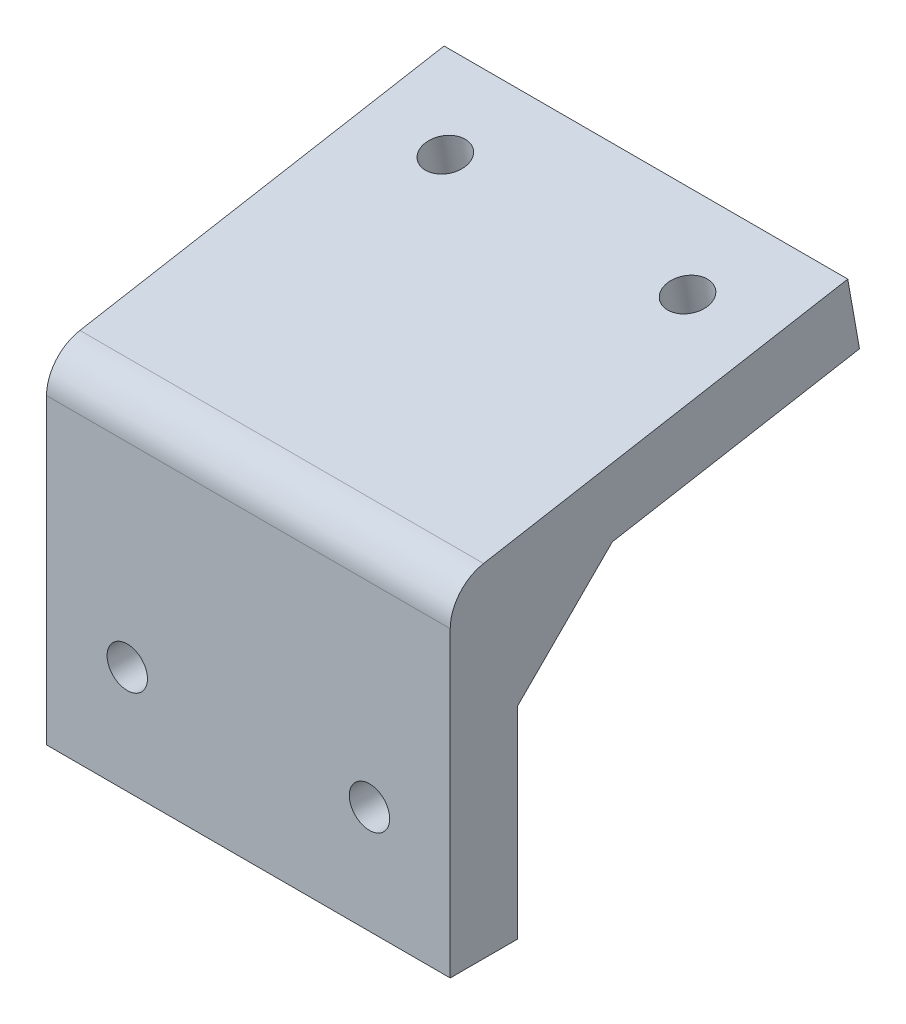
ISO-10303-21;
HEADER;
FILE_DESCRIPTION(('STEP AP214'),'2;1');
FILE_NAME('part.step','',(''),(''),'','','');
FILE_SCHEMA(('AUTOMOTIVE_DESIGN { 1 0 10303 214 1 1 1 1 }'));
ENDSEC;
DATA;
#1=APPLICATION_CONTEXT('core data for automotive mechanical design processes');
#2=APPLICATION_PROTOCOL_DEFINITION('international standard','automotive_design',2000,#1);
#3=PRODUCT_CONTEXT('',#1,'mechanical');
#4=PRODUCT('Part','Part','',(#3));
#5=PRODUCT_RELATED_PRODUCT_CATEGORY('part','',(#4));
#6=PRODUCT_DEFINITION_FORMATION('','',#4);
#7=PRODUCT_DEFINITION_CONTEXT('part definition',#1,'design');
#8=PRODUCT_DEFINITION('design','',#6,#7);
#9=PRODUCT_DEFINITION_SHAPE('','',#8);
#10=(LENGTH_UNIT() NAMED_UNIT(*) SI_UNIT(.MILLI.,.METRE.));
#11=(NAMED_UNIT(*) PLANE_ANGLE_UNIT() SI_UNIT($,.RADIAN.));
#12=(NAMED_UNIT(*) SI_UNIT($,.STERADIAN.) SOLID_ANGLE_UNIT());
#13=UNCERTAINTY_MEASURE_WITH_UNIT(LENGTH_MEASURE(1.E-05),#10,'distance_accuracy_value','');
#14=(GEOMETRIC_REPRESENTATION_CONTEXT(3) GLOBAL_UNCERTAINTY_ASSIGNED_CONTEXT((#13)) GLOBAL_UNIT_ASSIGNED_CONTEXT((#10,
#11,#12)) REPRESENTATION_CONTEXT('',''));
#15=CARTESIAN_POINT('',(0.,0.,0.));
#16=DIRECTION('',(0.,0.,1.));
#17=DIRECTION('',(1.,0.,0.));
#18=AXIS2_PLACEMENT_3D('',#15,#16,#17);
#19=CARTESIAN_POINT('',(30.,0.,0.));
#20=DIRECTION('',(0.,0.,-1.));
#21=DIRECTION('',(-1.,0.,0.));
#22=AXIS2_PLACEMENT_3D('',#19,#20,#21);
#23=PLANE('',#22);
#24=CARTESIAN_POINT('',(24.,8.,0.));
#25=DIRECTION('',(0.,0.,1.));
#26=DIRECTION('',(1.,0.,0.));
#27=AXIS2_PLACEMENT_3D('',#24,#25,#26);
#28=CIRCLE('',#27,1.5);
#29=CARTESIAN_POINT('',(25.5,8.,0.));
#30=VERTEX_POINT('',#29);
#31=EDGE_CURVE('E163',#30,#30,#28,.T.);
#32=ORIENTED_EDGE('',*,*,#31,.F.);
#33=EDGE_LOOP('',(#32));
#34=FACE_BOUND('',#33,.T.);
#35=CARTESIAN_POINT('',(6.,8.,0.));
#36=DIRECTION('',(0.,0.,1.));
#37=DIRECTION('',(1.,0.,0.));
#38=AXIS2_PLACEMENT_3D('',#35,#36,#37);
#39=CIRCLE('',#38,1.5);
#40=CARTESIAN_POINT('',(7.5,8.,0.));
#41=VERTEX_POINT('',#40);
#42=EDGE_CURVE('E155',#41,#41,#39,.T.);
#43=ORIENTED_EDGE('',*,*,#42,.F.);
#44=EDGE_LOOP('',(#43));
#45=FACE_BOUND('',#44,.T.);
#46=DIRECTION('',(0.,-1.,0.));
#47=VECTOR('',#46,1.);
#48=CARTESIAN_POINT('',(30.,0.,0.));
#49=LINE('',#48,#47);
#50=CARTESIAN_POINT('',(30.,22.4827011064682,0.));
#51=VERTEX_POINT('',#50);
#52=CARTESIAN_POINT('',(30.,0.,0.));
#53=VERTEX_POINT('',#52);
#54=EDGE_CURVE('E137',#51,#53,#49,.T.);
#55=ORIENTED_EDGE('',*,*,#54,.F.);
#56=DIRECTION('',(-1.,0.,0.));
#57=VECTOR('',#56,1.);
#58=CARTESIAN_POINT('',(30.,22.4827011064682,0.));
#59=LINE('',#58,#57);
#60=CARTESIAN_POINT('',(0.,22.4827011064682,0.));
#61=VERTEX_POINT('',#60);
#62=EDGE_CURVE('E149',#51,#61,#59,.T.);
#63=ORIENTED_EDGE('',*,*,#62,.T.);
#64=DIRECTION('',(0.,-1.,0.));
#65=VECTOR('',#64,1.);
#66=CARTESIAN_POINT('',(0.,0.,0.));
#67=LINE('',#66,#65);
#68=CARTESIAN_POINT('',(0.,0.,0.));
#69=VERTEX_POINT('',#68);
#70=EDGE_CURVE('E130',#61,#69,#67,.T.);
#71=ORIENTED_EDGE('',*,*,#70,.T.);
#72=DIRECTION('',(-1.,0.,0.));
#73=VECTOR('',#72,1.);
#74=CARTESIAN_POINT('',(30.,0.,0.));
#75=LINE('',#74,#73);
#76=EDGE_CURVE('E146',#53,#69,#75,.T.);
#77=ORIENTED_EDGE('',*,*,#76,.F.);
#78=EDGE_LOOP('',(#55,#63,#71,#77));
#79=FACE_BOUND('',#78,.T.);
#80=ADVANCED_FACE('F35',(#34,#45,#79),#23,.F.);
#81=CARTESIAN_POINT('',(30.,0.,0.));
#82=DIRECTION('',(0.,1.,0.));
#83=DIRECTION('',(0.,0.,1.));
#84=AXIS2_PLACEMENT_3D('',#81,#82,#83);
#85=PLANE('',#84);
#86=DIRECTION('',(0.,0.,-1.));
#87=VECTOR('',#86,1.);
#88=CARTESIAN_POINT('',(0.,0.,0.));
#89=LINE('',#88,#87);
#90=CARTESIAN_POINT('',(0.,0.,-5.));
#91=VERTEX_POINT('',#90);
#92=EDGE_CURVE('E126',#69,#91,#89,.T.);
#93=ORIENTED_EDGE('',*,*,#92,.T.);
#94=DIRECTION('',(-1.,0.,0.));
#95=VECTOR('',#94,1.);
#96=CARTESIAN_POINT('',(30.,0.,-5.));
#97=LINE('',#96,#95);
#98=CARTESIAN_POINT('',(30.,0.,-5.));
#99=VERTEX_POINT('',#98);
#100=EDGE_CURVE('E125',#99,#91,#97,.T.);
#101=ORIENTED_EDGE('',*,*,#100,.F.);
#102=DIRECTION('',(0.,0.,-1.));
#103=VECTOR('',#102,1.);
#104=CARTESIAN_POINT('',(30.,0.,0.));
#105=LINE('',#104,#103);
#106=EDGE_CURVE('E168',#53,#99,#105,.T.);
#107=ORIENTED_EDGE('',*,*,#106,.F.);
#108=ORIENTED_EDGE('',*,*,#76,.T.);
#109=EDGE_LOOP('',(#93,#101,#107,#108));
#110=FACE_BOUND('',#109,.T.);
#111=ADVANCED_FACE('F188',(#110),#85,.F.);
#112=CARTESIAN_POINT('',(30.,20.8045018441136,-5.));
#113=DIRECTION('',(0.,0.,1.));
#114=DIRECTION('',(0.,-1.,0.));
#115=AXIS2_PLACEMENT_3D('',#112,#113,#114);
#116=PLANE('',#115);
#117=CARTESIAN_POINT('',(24.,8.,-5.));
#118=DIRECTION('',(0.,0.,1.));
#119=DIRECTION('',(0.,-1.,0.));
#120=AXIS2_PLACEMENT_3D('',#117,#118,#119);
#121=CIRCLE('',#120,1.5);
#122=CARTESIAN_POINT('',(24.,6.5,-5.));
#123=VERTEX_POINT('',#122);
#124=EDGE_CURVE('E39',#123,#123,#121,.T.);
#125=ORIENTED_EDGE('',*,*,#124,.T.);
#126=EDGE_LOOP('',(#125));
#127=FACE_BOUND('',#126,.T.);
#128=CARTESIAN_POINT('',(6.,8.,-5.));
#129=DIRECTION('',(0.,0.,1.));
#130=DIRECTION('',(0.,-1.,0.));
#131=AXIS2_PLACEMENT_3D('',#128,#129,#130);
#132=CIRCLE('',#131,1.5);
#133=CARTESIAN_POINT('',(6.,6.5,-5.));
#134=VERTEX_POINT('',#133);
#135=EDGE_CURVE('E153',#134,#134,#132,.T.);
#136=ORIENTED_EDGE('',*,*,#135,.T.);
#137=EDGE_LOOP('',(#136));
#138=FACE_BOUND('',#137,.T.);
#139=DIRECTION('',(0.,1.,0.));
#140=VECTOR('',#139,1.);
#141=CARTESIAN_POINT('',(0.,20.8045018441136,-5.));
#142=LINE('',#141,#140);
#143=CARTESIAN_POINT('',(0.,15.,-5.));
#144=VERTEX_POINT('',#143);
#145=EDGE_CURVE('E106',#91,#144,#142,.T.);
#146=ORIENTED_EDGE('',*,*,#145,.T.);
#147=DIRECTION('',(1.,0.,0.));
#148=VECTOR('',#147,1.);
#149=CARTESIAN_POINT('',(-9.96609702940827,15.,-5.));
#150=LINE('',#149,#148);
#151=CARTESIAN_POINT('',(30.,15.,-5.));
#152=VERTEX_POINT('',#151);
#153=EDGE_CURVE('E112',#144,#152,#150,.T.);
#154=ORIENTED_EDGE('',*,*,#153,.T.);
#155=DIRECTION('',(0.,1.,0.));
#156=VECTOR('',#155,1.);
#157=CARTESIAN_POINT('',(30.,20.8045018441136,-5.));
#158=LINE('',#157,#156);
#159=EDGE_CURVE('E170',#99,#152,#158,.T.);
#160=ORIENTED_EDGE('',*,*,#159,.F.);
#161=ORIENTED_EDGE('',*,*,#100,.T.);
#162=EDGE_LOOP('',(#146,#154,#160,#161));
#163=FACE_BOUND('',#162,.T.);
#164=ADVANCED_FACE('F123',(#127,#138,#163),#116,.F.);
#165=CARTESIAN_POINT('',(30.,25.2854065649468,-30.4124734787009));
#166=DIRECTION('',(0.,0.984807753012209,0.173648177666927));
#167=DIRECTION('',(0.,-0.173648177666927,0.984807753012209));
#168=AXIS2_PLACEMENT_3D('',#165,#166,#167);
#169=PLANE('',#168);
#170=CARTESIAN_POINT('',(24.,24.2435174989452,-24.5036269606276));
#171=DIRECTION('',(0.,0.984807753012209,0.173648177666927));
#172=DIRECTION('',(0.,-0.173648177666927,0.984807753012209));
#173=AXIS2_PLACEMENT_3D('',#170,#171,#172);
#174=CIRCLE('',#173,1.5);
#175=CARTESIAN_POINT('',(24.,23.9830452324448,-23.0264153311093));
#176=VERTEX_POINT('',#175);
#177=EDGE_CURVE('E230',#176,#176,#174,.T.);
#178=ORIENTED_EDGE('',*,*,#177,.T.);
#179=EDGE_LOOP('',(#178));
#180=FACE_BOUND('',#179,.T.);
#181=CARTESIAN_POINT('',(6.,24.2435174989452,-24.5036269606276));
#182=DIRECTION('',(0.,0.984807753012209,0.173648177666927));
#183=DIRECTION('',(0.,-0.173648177666927,0.984807753012209));
#184=AXIS2_PLACEMENT_3D('',#181,#182,#183);
#185=CIRCLE('',#184,1.5);
#186=CARTESIAN_POINT('',(6.,23.9830452324448,-23.0264153311093));
#187=VERTEX_POINT('',#186);
#188=EDGE_CURVE('E233',#187,#187,#185,.T.);
#189=ORIENTED_EDGE('',*,*,#188,.T.);
#190=EDGE_LOOP('',(#189));
#191=FACE_BOUND('',#190,.T.);
#192=DIRECTION('',(0.,0.173648177666927,-0.984807753012209));
#193=VECTOR('',#192,1.);
#194=CARTESIAN_POINT('',(30.,25.2854065649468,-30.4124734787009));
#195=LINE('',#194,#193);
#196=CARTESIAN_POINT('',(30.,22.0470947914577,-12.0470947914577));
#197=VERTEX_POINT('',#196);
#198=CARTESIAN_POINT('',(30.,25.2854065649468,-30.4124734787009));
#199=VERTEX_POINT('',#198);
#200=EDGE_CURVE('E172',#197,#199,#195,.T.);
#201=ORIENTED_EDGE('',*,*,#200,.F.);
#202=DIRECTION('',(1.,0.,0.));
#203=VECTOR('',#202,1.);
#204=CARTESIAN_POINT('',(-9.96609702940827,22.0470947914577,-12.0470947914577));
#205=LINE('',#204,#203);
#206=CARTESIAN_POINT('',(0.,22.0470947914577,-12.0470947914577));
#207=VERTEX_POINT('',#206);
#208=EDGE_CURVE('E111',#207,#197,#205,.T.);
#209=ORIENTED_EDGE('',*,*,#208,.F.);
#210=DIRECTION('',(0.,0.173648177666927,-0.984807753012209));
#211=VECTOR('',#210,1.);
#212=CARTESIAN_POINT('',(0.,25.2854065649468,-30.4124734787009));
#213=LINE('',#212,#211);
#214=CARTESIAN_POINT('',(0.,25.2854065649468,-30.4124734787009));
#215=VERTEX_POINT('',#214);
#216=EDGE_CURVE('E108',#207,#215,#213,.T.);
#217=ORIENTED_EDGE('',*,*,#216,.T.);
#218=DIRECTION('',(-1.,0.,0.));
#219=VECTOR('',#218,1.);
#220=CARTESIAN_POINT('',(30.,25.2854065649468,-30.4124734787009));
#221=LINE('',#220,#219);
#222=EDGE_CURVE('E141',#199,#215,#221,.T.);
#223=ORIENTED_EDGE('',*,*,#222,.F.);
#224=EDGE_LOOP('',(#201,#209,#217,#223));
#225=FACE_BOUND('',#224,.T.);
#226=ADVANCED_FACE('F193',(#180,#191,#225),#169,.F.);
#227=CARTESIAN_POINT('',(30.,30.2094453300078,-29.5442325903663));
#228=DIRECTION('',(0.,-0.173648177666925,0.984807753012209));
#229=DIRECTION('',(0.,-0.984807753012209,-0.173648177666925));
#230=AXIS2_PLACEMENT_3D('',#227,#228,#229);
#231=PLANE('',#230);
#232=DIRECTION('',(0.,0.984807753012209,0.173648177666925));
#233=VECTOR('',#232,1.);
#234=CARTESIAN_POINT('',(0.,30.2094453300078,-29.5442325903663));
#235=LINE('',#234,#233);
#236=CARTESIAN_POINT('',(0.,30.2094453300078,-29.5442325903663));
#237=VERTEX_POINT('',#236);
#238=EDGE_CURVE('E128',#215,#237,#235,.T.);
#239=ORIENTED_EDGE('',*,*,#238,.T.);
#240=DIRECTION('',(-1.,0.,0.));
#241=VECTOR('',#240,1.);
#242=CARTESIAN_POINT('',(30.,30.2094453300078,-29.5442325903663));
#243=LINE('',#242,#241);
#244=CARTESIAN_POINT('',(30.,30.2094453300078,-29.5442325903663));
#245=VERTEX_POINT('',#244);
#246=EDGE_CURVE('E138',#245,#237,#243,.T.);
#247=ORIENTED_EDGE('',*,*,#246,.F.);
#248=DIRECTION('',(0.,0.984807753012209,0.173648177666925));
#249=VECTOR('',#248,1.);
#250=CARTESIAN_POINT('',(30.,30.2094453300078,-29.5442325903663));
#251=LINE('',#250,#249);
#252=EDGE_CURVE('E174',#199,#245,#251,.T.);
#253=ORIENTED_EDGE('',*,*,#252,.F.);
#254=ORIENTED_EDGE('',*,*,#222,.T.);
#255=EDGE_LOOP('',(#239,#247,#253,#254));
#256=FACE_BOUND('',#255,.T.);
#257=ADVANCED_FACE('F195',(#256),#231,.F.);
#258=CARTESIAN_POINT('',(30.,25.,0.));
#259=DIRECTION('',(0.,-0.984807753012208,-0.173648177666927));
#260=DIRECTION('',(0.,0.173648177666927,-0.984807753012209));
#261=AXIS2_PLACEMENT_3D('',#258,#259,#260);
#262=PLANE('',#261);
#263=CARTESIAN_POINT('',(24.,29.1675562640063,-23.635386072293));
#264=DIRECTION('',(0.,0.984807753012209,0.173648177666927));
#265=DIRECTION('',(0.,-0.173648177666927,0.984807753012209));
#266=AXIS2_PLACEMENT_3D('',#263,#264,#265);
#267=CIRCLE('',#266,1.5);
#268=CARTESIAN_POINT('',(24.,28.9070839975059,-22.1581744427747));
#269=VERTEX_POINT('',#268);
#270=EDGE_CURVE('E241',#269,#269,#267,.T.);
#271=ORIENTED_EDGE('',*,*,#270,.F.);
#272=EDGE_LOOP('',(#271));
#273=FACE_BOUND('',#272,.T.);
#274=CARTESIAN_POINT('',(6.,29.1675562640063,-23.635386072293));
#275=DIRECTION('',(0.,0.984807753012209,0.173648177666927));
#276=DIRECTION('',(0.,-0.173648177666927,0.984807753012209));
#277=AXIS2_PLACEMENT_3D('',#274,#275,#276);
#278=CIRCLE('',#277,1.5);
#279=CARTESIAN_POINT('',(6.,28.9070839975059,-22.1581744427747));
#280=VERTEX_POINT('',#279);
#281=EDGE_CURVE('E235',#280,#280,#278,.T.);
#282=ORIENTED_EDGE('',*,*,#281,.F.);
#283=EDGE_LOOP('',(#282));
#284=FACE_BOUND('',#283,.T.);
#285=DIRECTION('',(0.,-0.173648177666927,0.984807753012208));
#286=VECTOR('',#285,1.);
#287=CARTESIAN_POINT('',(0.,25.,0.));
#288=LINE('',#287,#286);
#289=CARTESIAN_POINT('',(0.,25.4371243655048,-2.47905546699922));
#290=VERTEX_POINT('',#289);
#291=EDGE_CURVE('E135',#237,#290,#288,.T.);
#292=ORIENTED_EDGE('',*,*,#291,.T.);
#293=DIRECTION('',(-1.,0.,0.));
#294=VECTOR('',#293,1.);
#295=CARTESIAN_POINT('',(30.,25.4371243655048,-2.47905546699922));
#296=LINE('',#295,#294);
#297=CARTESIAN_POINT('',(30.,25.4371243655048,-2.47905546699922));
#298=VERTEX_POINT('',#297);
#299=EDGE_CURVE('E44',#290,#298,#296,.F.);
#300=ORIENTED_EDGE('',*,*,#299,.T.);
#301=DIRECTION('',(0.,-0.173648177666927,0.984807753012208));
#302=VECTOR('',#301,1.);
#303=CARTESIAN_POINT('',(30.,25.,0.));
#304=LINE('',#303,#302);
#305=EDGE_CURVE('E142',#245,#298,#304,.T.);
#306=ORIENTED_EDGE('',*,*,#305,.F.);
#307=ORIENTED_EDGE('',*,*,#246,.T.);
#308=EDGE_LOOP('',(#292,#300,#306,#307));
#309=FACE_BOUND('',#308,.T.);
#310=ADVANCED_FACE('F196',(#273,#284,#309),#262,.F.);
#311=CARTESIAN_POINT('',(30.,0.,0.));
#312=DIRECTION('',(-1.,0.,0.));
#313=DIRECTION('',(0.,0.,1.));
#314=AXIS2_PLACEMENT_3D('',#311,#312,#313);
#315=PLANE('',#314);
#316=ORIENTED_EDGE('',*,*,#159,.T.);
#317=DIRECTION('',(0.,0.707106781186544,-0.707106781186551));
#318=VECTOR('',#317,1.);
#319=CARTESIAN_POINT('',(30.,22.0470947914577,-12.0470947914577));
#320=LINE('',#319,#318);
#321=EDGE_CURVE('E117',#152,#197,#320,.T.);
#322=ORIENTED_EDGE('',*,*,#321,.T.);
#323=ORIENTED_EDGE('',*,*,#200,.T.);
#324=ORIENTED_EDGE('',*,*,#252,.T.);
#325=ORIENTED_EDGE('',*,*,#305,.T.);
#326=CARTESIAN_POINT('',(30.,22.4827011064682,-3.));
#327=DIRECTION('',(-1.,0.,0.));
#328=DIRECTION('',(0.,0.,1.));
#329=AXIS2_PLACEMENT_3D('',#326,#327,#328);
#330=CIRCLE('',#329,3.);
#331=EDGE_CURVE('E11',#298,#51,#330,.F.);
#332=ORIENTED_EDGE('',*,*,#331,.T.);
#333=ORIENTED_EDGE('',*,*,#54,.T.);
#334=ORIENTED_EDGE('',*,*,#106,.T.);
#335=EDGE_LOOP('',(#316,#322,#323,#324,#325,#332,#333,#334));
#336=FACE_BOUND('',#335,.T.);
#337=ADVANCED_FACE('F178',(#336),#315,.F.);
#338=CARTESIAN_POINT('',(0.,0.,0.));
#339=DIRECTION('',(-1.,0.,0.));
#340=DIRECTION('',(0.,0.,1.));
#341=AXIS2_PLACEMENT_3D('',#338,#339,#340);
#342=PLANE('',#341);
#343=DIRECTION('',(0.,0.707106781186544,-0.707106781186551));
#344=VECTOR('',#343,1.);
#345=CARTESIAN_POINT('',(0.,22.0470947914577,-12.0470947914577));
#346=LINE('',#345,#344);
#347=EDGE_CURVE('E101',#144,#207,#346,.T.);
#348=ORIENTED_EDGE('',*,*,#347,.F.);
#349=ORIENTED_EDGE('',*,*,#145,.F.);
#350=ORIENTED_EDGE('',*,*,#92,.F.);
#351=ORIENTED_EDGE('',*,*,#70,.F.);
#352=CARTESIAN_POINT('',(0.,22.4827011064682,-3.));
#353=DIRECTION('',(-1.,0.,0.));
#354=DIRECTION('',(0.,0.,1.));
#355=AXIS2_PLACEMENT_3D('',#352,#353,#354);
#356=CIRCLE('',#355,3.);
#357=EDGE_CURVE('E59',#61,#290,#356,.T.);
#358=ORIENTED_EDGE('',*,*,#357,.T.);
#359=ORIENTED_EDGE('',*,*,#291,.F.);
#360=ORIENTED_EDGE('',*,*,#238,.F.);
#361=ORIENTED_EDGE('',*,*,#216,.F.);
#362=EDGE_LOOP('',(#348,#349,#350,#351,#358,#359,#360,#361));
#363=FACE_BOUND('',#362,.T.);
#364=ADVANCED_FACE('F103',(#363),#342,.T.);
#365=CARTESIAN_POINT('',(30.,22.4827011064682,-3.));
#366=DIRECTION('',(-1.,0.,0.));
#367=DIRECTION('',(0.,0.,1.));
#368=AXIS2_PLACEMENT_3D('',#365,#366,#367);
#369=CYLINDRICAL_SURFACE('',#368,3.);
#370=ORIENTED_EDGE('',*,*,#331,.F.);
#371=ORIENTED_EDGE('',*,*,#299,.F.);
#372=ORIENTED_EDGE('',*,*,#357,.F.);
#373=ORIENTED_EDGE('',*,*,#62,.F.);
#374=EDGE_LOOP('',(#370,#371,#372,#373));
#375=FACE_BOUND('',#374,.T.);
#376=ADVANCED_FACE('F37',(#375),#369,.T.);
#377=CARTESIAN_POINT('',(6.,8.,-30.4124734787009));
#378=DIRECTION('',(0.,0.,1.));
#379=DIRECTION('',(1.,0.,0.));
#380=AXIS2_PLACEMENT_3D('',#377,#378,#379);
#381=CYLINDRICAL_SURFACE('',#380,1.5);
#382=ORIENTED_EDGE('',*,*,#42,.T.);
#383=EDGE_LOOP('',(#382));
#384=FACE_BOUND('',#383,.T.);
#385=ORIENTED_EDGE('',*,*,#135,.F.);
#386=EDGE_LOOP('',(#385));
#387=FACE_BOUND('',#386,.T.);
#388=ADVANCED_FACE('F261',(#384,#387),#381,.F.);
#389=CARTESIAN_POINT('',(24.,8.,-30.4124734787009));
#390=DIRECTION('',(0.,0.,1.));
#391=DIRECTION('',(1.,0.,0.));
#392=AXIS2_PLACEMENT_3D('',#389,#390,#391);
#393=CYLINDRICAL_SURFACE('',#392,1.5);
#394=ORIENTED_EDGE('',*,*,#31,.T.);
#395=EDGE_LOOP('',(#394));
#396=FACE_BOUND('',#395,.T.);
#397=ORIENTED_EDGE('',*,*,#124,.F.);
#398=EDGE_LOOP('',(#397));
#399=FACE_BOUND('',#398,.T.);
#400=ADVANCED_FACE('F255',(#396,#399),#393,.F.);
#401=CARTESIAN_POINT('',(6.,-0.279440764854224,-28.827686149323));
#402=DIRECTION('',(0.,0.984807753012209,0.173648177666927));
#403=DIRECTION('',(0.,-0.173648177666927,0.984807753012209));
#404=AXIS2_PLACEMENT_3D('',#401,#402,#403);
#405=CYLINDRICAL_SURFACE('',#404,1.5);
#406=ORIENTED_EDGE('',*,*,#281,.T.);
#407=EDGE_LOOP('',(#406));
#408=FACE_BOUND('',#407,.T.);
#409=ORIENTED_EDGE('',*,*,#188,.F.);
#410=EDGE_LOOP('',(#409));
#411=FACE_BOUND('',#410,.T.);
#412=ADVANCED_FACE('F248',(#408,#411),#405,.F.);
#413=CARTESIAN_POINT('',(24.,-0.279440764854224,-28.827686149323));
#414=DIRECTION('',(0.,0.984807753012209,0.173648177666927));
#415=DIRECTION('',(0.,-0.173648177666927,0.984807753012209));
#416=AXIS2_PLACEMENT_3D('',#413,#414,#415);
#417=CYLINDRICAL_SURFACE('',#416,1.5);
#418=ORIENTED_EDGE('',*,*,#270,.T.);
#419=EDGE_LOOP('',(#418));
#420=FACE_BOUND('',#419,.T.);
#421=ORIENTED_EDGE('',*,*,#177,.F.);
#422=EDGE_LOOP('',(#421));
#423=FACE_BOUND('',#422,.T.);
#424=ADVANCED_FACE('F245',(#420,#423),#417,.F.);
#425=CARTESIAN_POINT('',(-9.96609702940827,22.0470947914577,-12.0470947914577));
#426=DIRECTION('',(0.,-0.707106781186551,-0.707106781186544));
#427=DIRECTION('',(0.,0.707106781186544,-0.707106781186551));
#428=AXIS2_PLACEMENT_3D('',#425,#426,#427);
#429=PLANE('',#428);
#430=ORIENTED_EDGE('',*,*,#153,.F.);
#431=ORIENTED_EDGE('',*,*,#347,.T.);
#432=ORIENTED_EDGE('',*,*,#208,.T.);
#433=ORIENTED_EDGE('',*,*,#321,.F.);
#434=EDGE_LOOP('',(#430,#431,#432,#433));
#435=FACE_BOUND('',#434,.T.);
#436=ADVANCED_FACE('F115',(#435),#429,.T.);
#437=CLOSED_SHELL('',(#80,#111,#164,#226,#257,#310,#337,#364,#376,#388,#400,#412,#424,#436));
#438=MANIFOLD_SOLID_BREP('B2',#437);
#439=ADVANCED_BREP_SHAPE_REPRESENTATION('',(#18,#438),#14);
#440=SHAPE_DEFINITION_REPRESENTATION(#9,#439);
ENDSEC;
END-ISO-10303-21;
